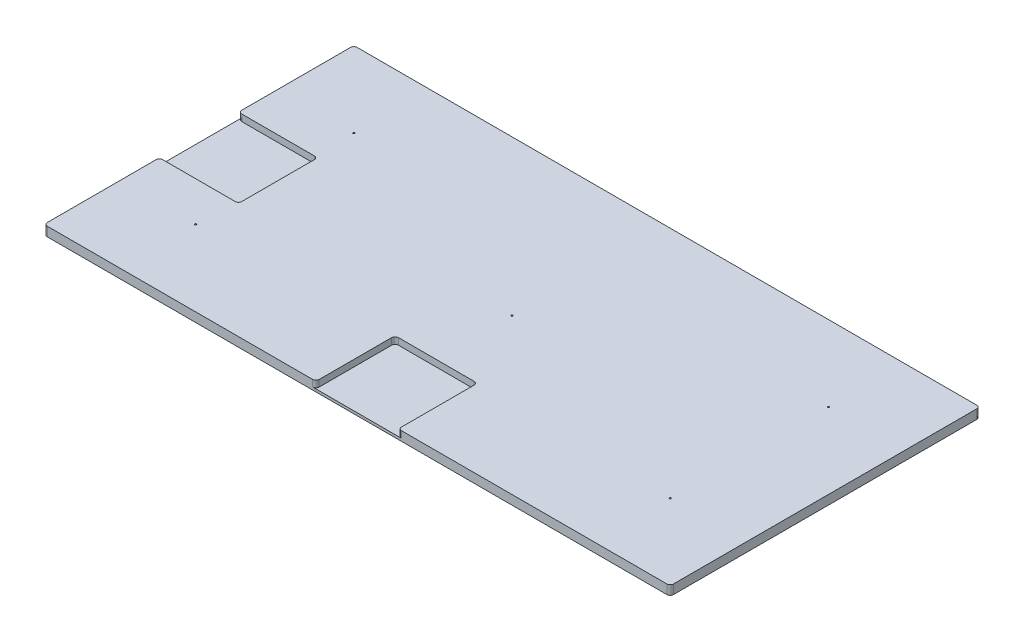
ISO-10303-21;
HEADER;
FILE_DESCRIPTION(('STEP AP214'),'2;1');
FILE_NAME('part.step','',(''),(''),'','','');
FILE_SCHEMA(('AUTOMOTIVE_DESIGN { 1 0 10303 214 1 1 1 1 }'));
ENDSEC;
DATA;
#1=APPLICATION_CONTEXT('core data for automotive mechanical design processes');
#2=APPLICATION_PROTOCOL_DEFINITION('international standard','automotive_design',2000,#1);
#3=PRODUCT_CONTEXT('',#1,'mechanical');
#4=PRODUCT('Part','Part','',(#3));
#5=PRODUCT_RELATED_PRODUCT_CATEGORY('part','',(#4));
#6=PRODUCT_DEFINITION_FORMATION('','',#4);
#7=PRODUCT_DEFINITION_CONTEXT('part definition',#1,'design');
#8=PRODUCT_DEFINITION('design','',#6,#7);
#9=PRODUCT_DEFINITION_SHAPE('','',#8);
#10=(LENGTH_UNIT() NAMED_UNIT(*) SI_UNIT(.MILLI.,.METRE.));
#11=(NAMED_UNIT(*) PLANE_ANGLE_UNIT() SI_UNIT($,.RADIAN.));
#12=(NAMED_UNIT(*) SI_UNIT($,.STERADIAN.) SOLID_ANGLE_UNIT());
#13=UNCERTAINTY_MEASURE_WITH_UNIT(LENGTH_MEASURE(1.E-05),#10,'distance_accuracy_value','');
#14=(GEOMETRIC_REPRESENTATION_CONTEXT(3) GLOBAL_UNCERTAINTY_ASSIGNED_CONTEXT((#13)) GLOBAL_UNIT_ASSIGNED_CONTEXT((#10,
#11,#12)) REPRESENTATION_CONTEXT('',''));
#15=CARTESIAN_POINT('',(0.,0.,0.));
#16=DIRECTION('',(0.,0.,1.));
#17=DIRECTION('',(1.,0.,0.));
#18=AXIS2_PLACEMENT_3D('',#15,#16,#17);
#19=CARTESIAN_POINT('',(603.25,17.78,298.45));
#20=DIRECTION('',(-1.,0.,0.));
#21=DIRECTION('',(0.,0.,1.));
#22=AXIS2_PLACEMENT_3D('',#19,#20,#21);
#23=PLANE('',#22);
#24=DIRECTION('',(0.,0.,-1.));
#25=VECTOR('',#24,1.);
#26=CARTESIAN_POINT('',(603.25,0.,298.45));
#27=LINE('',#26,#25);
#28=CARTESIAN_POINT('',(603.25,0.,292.1));
#29=VERTEX_POINT('',#28);
#30=CARTESIAN_POINT('',(603.25,0.,-292.1));
#31=VERTEX_POINT('',#30);
#32=EDGE_CURVE('E224',#29,#31,#27,.T.);
#33=ORIENTED_EDGE('',*,*,#32,.T.);
#34=DIRECTION('',(0.,-1.,0.));
#35=VECTOR('',#34,1.);
#36=CARTESIAN_POINT('',(603.25,17.78,-292.1));
#37=LINE('',#36,#35);
#38=CARTESIAN_POINT('',(603.25,17.78,-292.1));
#39=VERTEX_POINT('',#38);
#40=EDGE_CURVE('E202',#31,#39,#37,.F.);
#41=ORIENTED_EDGE('',*,*,#40,.T.);
#42=DIRECTION('',(0.,0.,-1.));
#43=VECTOR('',#42,1.);
#44=CARTESIAN_POINT('',(603.25,17.78,298.45));
#45=LINE('',#44,#43);
#46=CARTESIAN_POINT('',(603.25,17.78,292.1));
#47=VERTEX_POINT('',#46);
#48=EDGE_CURVE('E235',#47,#39,#45,.T.);
#49=ORIENTED_EDGE('',*,*,#48,.F.);
#50=DIRECTION('',(0.,-1.,0.));
#51=VECTOR('',#50,1.);
#52=CARTESIAN_POINT('',(603.25,17.78,292.1));
#53=LINE('',#52,#51);
#54=EDGE_CURVE('E207',#47,#29,#53,.T.);
#55=ORIENTED_EDGE('',*,*,#54,.T.);
#56=EDGE_LOOP('',(#33,#41,#49,#55));
#57=FACE_BOUND('',#56,.T.);
#58=ADVANCED_FACE('F35',(#57),#23,.F.);
#59=CARTESIAN_POINT('',(-603.25,17.78,-298.45));
#60=DIRECTION('',(0.,0.,1.));
#61=DIRECTION('',(1.,0.,0.));
#62=AXIS2_PLACEMENT_3D('',#59,#60,#61);
#63=PLANE('',#62);
#64=DIRECTION('',(-1.,0.,0.));
#65=VECTOR('',#64,1.);
#66=CARTESIAN_POINT('',(-603.25,17.78,-298.45));
#67=LINE('',#66,#65);
#68=CARTESIAN_POINT('',(596.9,17.78,-298.45));
#69=VERTEX_POINT('',#68);
#70=CARTESIAN_POINT('',(-596.9,17.78,-298.45));
#71=VERTEX_POINT('',#70);
#72=EDGE_CURVE('E217',#69,#71,#67,.T.);
#73=ORIENTED_EDGE('',*,*,#72,.F.);
#74=DIRECTION('',(0.,-1.,0.));
#75=VECTOR('',#74,1.);
#76=CARTESIAN_POINT('',(596.9,17.78,-298.45));
#77=LINE('',#76,#75);
#78=CARTESIAN_POINT('',(596.9,0.,-298.45));
#79=VERTEX_POINT('',#78);
#80=EDGE_CURVE('E201',#69,#79,#77,.T.);
#81=ORIENTED_EDGE('',*,*,#80,.T.);
#82=DIRECTION('',(-1.,0.,0.));
#83=VECTOR('',#82,1.);
#84=CARTESIAN_POINT('',(-603.25,0.,-298.45));
#85=LINE('',#84,#83);
#86=CARTESIAN_POINT('',(-596.9,0.,-298.45));
#87=VERTEX_POINT('',#86);
#88=EDGE_CURVE('E214',#79,#87,#85,.T.);
#89=ORIENTED_EDGE('',*,*,#88,.T.);
#90=DIRECTION('',(0.,-1.,0.));
#91=VECTOR('',#90,1.);
#92=CARTESIAN_POINT('',(-596.9,17.78,-298.45));
#93=LINE('',#92,#91);
#94=EDGE_CURVE('E219',#87,#71,#93,.F.);
#95=ORIENTED_EDGE('',*,*,#94,.T.);
#96=EDGE_LOOP('',(#73,#81,#89,#95));
#97=FACE_BOUND('',#96,.T.);
#98=ADVANCED_FACE('F213',(#97),#63,.F.);
#99=CARTESIAN_POINT('',(-603.25,17.78,298.45));
#100=DIRECTION('',(1.,0.,0.));
#101=DIRECTION('',(0.,0.,-1.));
#102=AXIS2_PLACEMENT_3D('',#99,#100,#101);
#103=PLANE('',#102);
#104=DIRECTION('',(0.,0.,1.));
#105=VECTOR('',#104,1.);
#106=CARTESIAN_POINT('',(-603.25,17.78,298.45));
#107=LINE('',#106,#105);
#108=CARTESIAN_POINT('',(-603.25,17.78,82.55));
#109=VERTEX_POINT('',#108);
#110=CARTESIAN_POINT('',(-603.25,17.78,292.1));
#111=VERTEX_POINT('',#110);
#112=EDGE_CURVE('E419',#109,#111,#107,.T.);
#113=ORIENTED_EDGE('',*,*,#112,.F.);
#114=DIRECTION('',(0.,1.,0.));
#115=VECTOR('',#114,1.);
#116=CARTESIAN_POINT('',(-603.25,17.78,82.55));
#117=LINE('',#116,#115);
#118=CARTESIAN_POINT('',(-603.25,5.08,82.55));
#119=VERTEX_POINT('',#118);
#120=EDGE_CURVE('E306',#109,#119,#117,.F.);
#121=ORIENTED_EDGE('',*,*,#120,.T.);
#122=DIRECTION('',(0.,0.,1.));
#123=VECTOR('',#122,1.);
#124=CARTESIAN_POINT('',(-603.25,5.08,-76.2));
#125=LINE('',#124,#123);
#126=CARTESIAN_POINT('',(-603.25,5.08,-82.55));
#127=VERTEX_POINT('',#126);
#128=EDGE_CURVE('E360',#127,#119,#125,.T.);
#129=ORIENTED_EDGE('',*,*,#128,.F.);
#130=DIRECTION('',(0.,1.,0.));
#131=VECTOR('',#130,1.);
#132=CARTESIAN_POINT('',(-603.25,17.78,-82.55));
#133=LINE('',#132,#131);
#134=CARTESIAN_POINT('',(-603.25,17.78,-82.55));
#135=VERTEX_POINT('',#134);
#136=EDGE_CURVE('E303',#127,#135,#133,.T.);
#137=ORIENTED_EDGE('',*,*,#136,.T.);
#138=CARTESIAN_POINT('',(-603.25,17.78,-292.1));
#139=VERTEX_POINT('',#138);
#140=EDGE_CURVE('E420',#139,#135,#107,.T.);
#141=ORIENTED_EDGE('',*,*,#140,.F.);
#142=DIRECTION('',(0.,-1.,0.));
#143=VECTOR('',#142,1.);
#144=CARTESIAN_POINT('',(-603.25,17.78,-292.1));
#145=LINE('',#144,#143);
#146=CARTESIAN_POINT('',(-603.25,0.,-292.1));
#147=VERTEX_POINT('',#146);
#148=EDGE_CURVE('E259',#139,#147,#145,.T.);
#149=ORIENTED_EDGE('',*,*,#148,.T.);
#150=DIRECTION('',(0.,0.,1.));
#151=VECTOR('',#150,1.);
#152=CARTESIAN_POINT('',(-603.25,0.,298.45));
#153=LINE('',#152,#151);
#154=CARTESIAN_POINT('',(-603.25,0.,292.1));
#155=VERTEX_POINT('',#154);
#156=EDGE_CURVE('E223',#147,#155,#153,.T.);
#157=ORIENTED_EDGE('',*,*,#156,.T.);
#158=DIRECTION('',(0.,-1.,0.));
#159=VECTOR('',#158,1.);
#160=CARTESIAN_POINT('',(-603.25,17.78,292.1));
#161=LINE('',#160,#159);
#162=EDGE_CURVE('E262',#155,#111,#161,.F.);
#163=ORIENTED_EDGE('',*,*,#162,.T.);
#164=EDGE_LOOP('',(#113,#121,#129,#137,#141,#149,#157,#163));
#165=FACE_BOUND('',#164,.T.);
#166=ADVANCED_FACE('F442',(#165),#103,.F.);
#167=CARTESIAN_POINT('',(-603.25,17.78,298.45));
#168=DIRECTION('',(0.,0.,-1.));
#169=DIRECTION('',(-1.,0.,0.));
#170=AXIS2_PLACEMENT_3D('',#167,#168,#169);
#171=PLANE('',#170);
#172=DIRECTION('',(1.,0.,0.));
#173=VECTOR('',#172,1.);
#174=CARTESIAN_POINT('',(-603.25,17.78,298.45));
#175=LINE('',#174,#173);
#176=CARTESIAN_POINT('',(85.7250000000001,17.78,298.45));
#177=VERTEX_POINT('',#176);
#178=CARTESIAN_POINT('',(596.9,17.78,298.45));
#179=VERTEX_POINT('',#178);
#180=EDGE_CURVE('E422',#177,#179,#175,.T.);
#181=ORIENTED_EDGE('',*,*,#180,.F.);
#182=DIRECTION('',(0.,1.,0.));
#183=VECTOR('',#182,1.);
#184=CARTESIAN_POINT('',(85.7250000000001,17.78,298.45));
#185=LINE('',#184,#183);
#186=CARTESIAN_POINT('',(85.725,5.08,298.45));
#187=VERTEX_POINT('',#186);
#188=EDGE_CURVE('E281',#177,#187,#185,.F.);
#189=ORIENTED_EDGE('',*,*,#188,.T.);
#190=DIRECTION('',(1.,0.,0.));
#191=VECTOR('',#190,1.);
#192=CARTESIAN_POINT('',(-79.3749999999999,5.08,298.45));
#193=LINE('',#192,#191);
#194=CARTESIAN_POINT('',(-85.7249999999999,5.08,298.45));
#195=VERTEX_POINT('',#194);
#196=EDGE_CURVE('E378',#195,#187,#193,.T.);
#197=ORIENTED_EDGE('',*,*,#196,.F.);
#198=DIRECTION('',(0.,1.,0.));
#199=VECTOR('',#198,1.);
#200=CARTESIAN_POINT('',(-85.7249999999999,17.78,298.45));
#201=LINE('',#200,#199);
#202=CARTESIAN_POINT('',(-85.7249999999999,17.78,298.45));
#203=VERTEX_POINT('',#202);
#204=EDGE_CURVE('E278',#195,#203,#201,.T.);
#205=ORIENTED_EDGE('',*,*,#204,.T.);
#206=CARTESIAN_POINT('',(-596.9,17.78,298.45));
#207=VERTEX_POINT('',#206);
#208=EDGE_CURVE('E236',#207,#203,#175,.T.);
#209=ORIENTED_EDGE('',*,*,#208,.F.);
#210=DIRECTION('',(0.,-1.,0.));
#211=VECTOR('',#210,1.);
#212=CARTESIAN_POINT('',(-596.9,17.78,298.45));
#213=LINE('',#212,#211);
#214=CARTESIAN_POINT('',(-596.9,0.,298.45));
#215=VERTEX_POINT('',#214);
#216=EDGE_CURVE('E253',#207,#215,#213,.T.);
#217=ORIENTED_EDGE('',*,*,#216,.T.);
#218=DIRECTION('',(1.,0.,0.));
#219=VECTOR('',#218,1.);
#220=CARTESIAN_POINT('',(-603.25,0.,298.45));
#221=LINE('',#220,#219);
#222=CARTESIAN_POINT('',(596.9,0.,298.45));
#223=VERTEX_POINT('',#222);
#224=EDGE_CURVE('E227',#215,#223,#221,.T.);
#225=ORIENTED_EDGE('',*,*,#224,.T.);
#226=DIRECTION('',(0.,-1.,0.));
#227=VECTOR('',#226,1.);
#228=CARTESIAN_POINT('',(596.9,17.78,298.45));
#229=LINE('',#228,#227);
#230=EDGE_CURVE('E256',#223,#179,#229,.F.);
#231=ORIENTED_EDGE('',*,*,#230,.T.);
#232=EDGE_LOOP('',(#181,#189,#197,#205,#209,#217,#225,#231));
#233=FACE_BOUND('',#232,.T.);
#234=ADVANCED_FACE('F431',(#233),#171,.F.);
#235=CARTESIAN_POINT('',(0.,17.78,0.));
#236=DIRECTION('',(0.,-1.,0.));
#237=DIRECTION('',(0.,0.,-1.));
#238=AXIS2_PLACEMENT_3D('',#235,#236,#237);
#239=PLANE('',#238);
#240=CARTESIAN_POINT('',(457.2,17.78,-152.4));
#241=DIRECTION('',(0.,1.,0.));
#242=DIRECTION('',(0.,0.,1.));
#243=AXIS2_PLACEMENT_3D('',#240,#241,#242);
#244=CIRCLE('',#243,1.58749999999996);
#245=CARTESIAN_POINT('',(457.2,17.78,-150.8125));
#246=VERTEX_POINT('',#245);
#247=EDGE_CURVE('E380',#246,#246,#244,.T.);
#248=ORIENTED_EDGE('',*,*,#247,.F.);
#249=EDGE_LOOP('',(#248));
#250=FACE_BOUND('',#249,.T.);
#251=CARTESIAN_POINT('',(-457.2,17.78,152.4));
#252=DIRECTION('',(0.,1.,0.));
#253=DIRECTION('',(0.,0.,1.));
#254=AXIS2_PLACEMENT_3D('',#251,#252,#253);
#255=CIRCLE('',#254,1.58749999999996);
#256=CARTESIAN_POINT('',(-457.2,17.78,153.9875));
#257=VERTEX_POINT('',#256);
#258=EDGE_CURVE('E393',#257,#257,#255,.T.);
#259=ORIENTED_EDGE('',*,*,#258,.F.);
#260=EDGE_LOOP('',(#259));
#261=FACE_BOUND('',#260,.T.);
#262=CARTESIAN_POINT('',(-457.2,17.78,-152.4));
#263=DIRECTION('',(0.,1.,0.));
#264=DIRECTION('',(0.,0.,1.));
#265=AXIS2_PLACEMENT_3D('',#262,#263,#264);
#266=CIRCLE('',#265,1.58749999999996);
#267=CARTESIAN_POINT('',(-457.2,17.78,-150.8125));
#268=VERTEX_POINT('',#267);
#269=EDGE_CURVE('E399',#268,#268,#266,.T.);
#270=ORIENTED_EDGE('',*,*,#269,.F.);
#271=EDGE_LOOP('',(#270));
#272=FACE_BOUND('',#271,.T.);
#273=CARTESIAN_POINT('',(457.2,17.78,152.4));
#274=DIRECTION('',(0.,1.,0.));
#275=DIRECTION('',(0.,0.,1.));
#276=AXIS2_PLACEMENT_3D('',#273,#274,#275);
#277=CIRCLE('',#276,1.58749999999996);
#278=CARTESIAN_POINT('',(457.2,17.78,153.9875));
#279=VERTEX_POINT('',#278);
#280=EDGE_CURVE('E405',#279,#279,#277,.T.);
#281=ORIENTED_EDGE('',*,*,#280,.F.);
#282=EDGE_LOOP('',(#281));
#283=FACE_BOUND('',#282,.T.);
#284=CARTESIAN_POINT('',(0.,17.78,0.));
#285=DIRECTION('',(0.,1.,0.));
#286=DIRECTION('',(0.,0.,1.));
#287=AXIS2_PLACEMENT_3D('',#284,#285,#286);
#288=CIRCLE('',#287,1.58749999999999);
#289=CARTESIAN_POINT('',(0.,17.78,1.58749999999999));
#290=VERTEX_POINT('',#289);
#291=EDGE_CURVE('E411',#290,#290,#288,.T.);
#292=ORIENTED_EDGE('',*,*,#291,.F.);
#293=EDGE_LOOP('',(#292));
#294=FACE_BOUND('',#293,.T.);
#295=DIRECTION('',(0.,0.,-1.));
#296=VECTOR('',#295,1.);
#297=CARTESIAN_POINT('',(79.3750000000001,17.78,146.05));
#298=LINE('',#297,#296);
#299=CARTESIAN_POINT('',(79.3750000000001,17.78,292.1));
#300=VERTEX_POINT('',#299);
#301=CARTESIAN_POINT('',(79.3750000000001,17.78,152.4));
#302=VERTEX_POINT('',#301);
#303=EDGE_CURVE('E358',#300,#302,#298,.T.);
#304=ORIENTED_EDGE('',*,*,#303,.F.);
#305=CARTESIAN_POINT('',(85.7250000000001,17.78,292.1));
#306=DIRECTION('',(0.,-1.,0.));
#307=DIRECTION('',(0.,0.,-1.));
#308=AXIS2_PLACEMENT_3D('',#305,#306,#307);
#309=CIRCLE('',#308,6.35);
#310=EDGE_CURVE('E276',#300,#177,#309,.F.);
#311=ORIENTED_EDGE('',*,*,#310,.T.);
#312=ORIENTED_EDGE('',*,*,#180,.T.);
#313=CARTESIAN_POINT('',(596.9,17.78,292.1));
#314=DIRECTION('',(0.,-1.,0.));
#315=DIRECTION('',(0.,0.,-1.));
#316=AXIS2_PLACEMENT_3D('',#313,#314,#315);
#317=CIRCLE('',#316,6.35);
#318=EDGE_CURVE('E249',#179,#47,#317,.F.);
#319=ORIENTED_EDGE('',*,*,#318,.T.);
#320=ORIENTED_EDGE('',*,*,#48,.T.);
#321=CARTESIAN_POINT('',(596.9,17.78,-292.1));
#322=DIRECTION('',(0.,-1.,0.));
#323=DIRECTION('',(0.,0.,-1.));
#324=AXIS2_PLACEMENT_3D('',#321,#322,#323);
#325=CIRCLE('',#324,6.35);
#326=EDGE_CURVE('E251',#39,#69,#325,.F.);
#327=ORIENTED_EDGE('',*,*,#326,.T.);
#328=ORIENTED_EDGE('',*,*,#72,.T.);
#329=CARTESIAN_POINT('',(-596.9,17.78,-292.1));
#330=DIRECTION('',(0.,-1.,0.));
#331=DIRECTION('',(0.,0.,-1.));
#332=AXIS2_PLACEMENT_3D('',#329,#330,#331);
#333=CIRCLE('',#332,6.35);
#334=EDGE_CURVE('E245',#71,#139,#333,.F.);
#335=ORIENTED_EDGE('',*,*,#334,.T.);
#336=ORIENTED_EDGE('',*,*,#140,.T.);
#337=CARTESIAN_POINT('',(-596.9,17.78,-82.55));
#338=DIRECTION('',(0.,-1.,0.));
#339=DIRECTION('',(0.,0.,-1.));
#340=AXIS2_PLACEMENT_3D('',#337,#338,#339);
#341=CIRCLE('',#340,6.35);
#342=CARTESIAN_POINT('',(-596.9,17.78,-76.2));
#343=VERTEX_POINT('',#342);
#344=EDGE_CURVE('E270',#135,#343,#341,.F.);
#345=ORIENTED_EDGE('',*,*,#344,.T.);
#346=DIRECTION('',(-1.,0.,0.));
#347=VECTOR('',#346,1.);
#348=CARTESIAN_POINT('',(-450.85,17.78,-76.2));
#349=LINE('',#348,#347);
#350=CARTESIAN_POINT('',(-457.2,17.78,-76.2));
#351=VERTEX_POINT('',#350);
#352=EDGE_CURVE('E365',#351,#343,#349,.T.);
#353=ORIENTED_EDGE('',*,*,#352,.F.);
#354=CARTESIAN_POINT('',(-457.2,17.78,-69.85));
#355=DIRECTION('',(0.,-1.,0.));
#356=DIRECTION('',(0.,0.,-1.));
#357=AXIS2_PLACEMENT_3D('',#354,#355,#356);
#358=CIRCLE('',#357,6.35);
#359=CARTESIAN_POINT('',(-450.85,17.78,-69.85));
#360=VERTEX_POINT('',#359);
#361=EDGE_CURVE('E11',#351,#360,#358,.T.);
#362=ORIENTED_EDGE('',*,*,#361,.T.);
#363=DIRECTION('',(0.,0.,-1.));
#364=VECTOR('',#363,1.);
#365=CARTESIAN_POINT('',(-450.85,17.78,-76.2));
#366=LINE('',#365,#364);
#367=CARTESIAN_POINT('',(-450.85,17.78,69.85));
#368=VERTEX_POINT('',#367);
#369=EDGE_CURVE('E341',#368,#360,#366,.T.);
#370=ORIENTED_EDGE('',*,*,#369,.F.);
#371=CARTESIAN_POINT('',(-457.2,17.78,69.85));
#372=DIRECTION('',(0.,-1.,0.));
#373=DIRECTION('',(0.,0.,-1.));
#374=AXIS2_PLACEMENT_3D('',#371,#372,#373);
#375=CIRCLE('',#374,6.35);
#376=CARTESIAN_POINT('',(-457.2,17.78,76.2));
#377=VERTEX_POINT('',#376);
#378=EDGE_CURVE('E43',#368,#377,#375,.T.);
#379=ORIENTED_EDGE('',*,*,#378,.T.);
#380=DIRECTION('',(1.,0.,0.));
#381=VECTOR('',#380,1.);
#382=CARTESIAN_POINT('',(-450.85,17.78,76.2));
#383=LINE('',#382,#381);
#384=CARTESIAN_POINT('',(-596.9,17.78,76.2));
#385=VERTEX_POINT('',#384);
#386=EDGE_CURVE('E340',#385,#377,#383,.T.);
#387=ORIENTED_EDGE('',*,*,#386,.F.);
#388=CARTESIAN_POINT('',(-596.9,17.78,82.55));
#389=DIRECTION('',(0.,-1.,0.));
#390=DIRECTION('',(0.,0.,-1.));
#391=AXIS2_PLACEMENT_3D('',#388,#389,#390);
#392=CIRCLE('',#391,6.35);
#393=EDGE_CURVE('E272',#385,#109,#392,.F.);
#394=ORIENTED_EDGE('',*,*,#393,.T.);
#395=ORIENTED_EDGE('',*,*,#112,.T.);
#396=CARTESIAN_POINT('',(-596.9,17.78,292.1));
#397=DIRECTION('',(0.,-1.,0.));
#398=DIRECTION('',(0.,0.,-1.));
#399=AXIS2_PLACEMENT_3D('',#396,#397,#398);
#400=CIRCLE('',#399,6.35);
#401=EDGE_CURVE('E247',#111,#207,#400,.F.);
#402=ORIENTED_EDGE('',*,*,#401,.T.);
#403=ORIENTED_EDGE('',*,*,#208,.T.);
#404=CARTESIAN_POINT('',(-85.7249999999999,17.78,292.1));
#405=DIRECTION('',(0.,-1.,0.));
#406=DIRECTION('',(0.,0.,-1.));
#407=AXIS2_PLACEMENT_3D('',#404,#405,#406);
#408=CIRCLE('',#407,6.35);
#409=CARTESIAN_POINT('',(-79.3749999999999,17.78,292.1));
#410=VERTEX_POINT('',#409);
#411=EDGE_CURVE('E274',#203,#410,#408,.F.);
#412=ORIENTED_EDGE('',*,*,#411,.T.);
#413=DIRECTION('',(0.,0.,1.));
#414=VECTOR('',#413,1.);
#415=CARTESIAN_POINT('',(-79.3749999999999,17.78,146.05));
#416=LINE('',#415,#414);
#417=CARTESIAN_POINT('',(-79.3749999999999,17.78,152.4));
#418=VERTEX_POINT('',#417);
#419=EDGE_CURVE('E372',#418,#410,#416,.T.);
#420=ORIENTED_EDGE('',*,*,#419,.F.);
#421=CARTESIAN_POINT('',(-73.0249999999999,17.78,152.4));
#422=DIRECTION('',(0.,-1.,0.));
#423=DIRECTION('',(0.,0.,-1.));
#424=AXIS2_PLACEMENT_3D('',#421,#422,#423);
#425=CIRCLE('',#424,6.35);
#426=CARTESIAN_POINT('',(-73.0249999999999,17.78,146.05));
#427=VERTEX_POINT('',#426);
#428=EDGE_CURVE('E326',#418,#427,#425,.T.);
#429=ORIENTED_EDGE('',*,*,#428,.T.);
#430=DIRECTION('',(-1.,0.,0.));
#431=VECTOR('',#430,1.);
#432=CARTESIAN_POINT('',(-79.3749999999999,17.78,146.05));
#433=LINE('',#432,#431);
#434=CARTESIAN_POINT('',(73.025,17.78,146.05));
#435=VERTEX_POINT('',#434);
#436=EDGE_CURVE('E383',#435,#427,#433,.T.);
#437=ORIENTED_EDGE('',*,*,#436,.F.);
#438=CARTESIAN_POINT('',(73.0250000000001,17.78,152.4));
#439=DIRECTION('',(0.,-1.,0.));
#440=DIRECTION('',(0.,0.,-1.));
#441=AXIS2_PLACEMENT_3D('',#438,#439,#440);
#442=CIRCLE('',#441,6.35);
#443=EDGE_CURVE('E328',#435,#302,#442,.T.);
#444=ORIENTED_EDGE('',*,*,#443,.T.);
#445=EDGE_LOOP('',(#304,#311,#312,#319,#320,#327,#328,#335,#336,#345,#353,#362,#370,#379,#387,
#394,#395,#402,#403,#412,#420,#429,#437,#444));
#446=FACE_BOUND('',#445,.T.);
#447=ADVANCED_FACE('F339',(#250,#261,#272,#283,#294,#446),#239,.F.);
#448=CARTESIAN_POINT('',(0.,0.,0.));
#449=DIRECTION('',(0.,-1.,0.));
#450=DIRECTION('',(0.,0.,-1.));
#451=AXIS2_PLACEMENT_3D('',#448,#449,#450);
#452=PLANE('',#451);
#453=CARTESIAN_POINT('',(457.2,0.,-152.4));
#454=DIRECTION('',(0.,1.,0.));
#455=DIRECTION('',(0.,0.,1.));
#456=AXIS2_PLACEMENT_3D('',#453,#454,#455);
#457=CIRCLE('',#456,1.58750000000002);
#458=CARTESIAN_POINT('',(457.2,0.,-150.8125));
#459=VERTEX_POINT('',#458);
#460=EDGE_CURVE('E390',#459,#459,#457,.T.);
#461=ORIENTED_EDGE('',*,*,#460,.T.);
#462=EDGE_LOOP('',(#461));
#463=FACE_BOUND('',#462,.T.);
#464=CARTESIAN_POINT('',(-457.2,0.,152.4));
#465=DIRECTION('',(0.,1.,0.));
#466=DIRECTION('',(0.,0.,1.));
#467=AXIS2_PLACEMENT_3D('',#464,#465,#466);
#468=CIRCLE('',#467,1.58750000000002);
#469=CARTESIAN_POINT('',(-457.2,0.,153.9875));
#470=VERTEX_POINT('',#469);
#471=EDGE_CURVE('E396',#470,#470,#468,.T.);
#472=ORIENTED_EDGE('',*,*,#471,.T.);
#473=EDGE_LOOP('',(#472));
#474=FACE_BOUND('',#473,.T.);
#475=CARTESIAN_POINT('',(-457.2,0.,-152.4));
#476=DIRECTION('',(0.,1.,0.));
#477=DIRECTION('',(0.,0.,1.));
#478=AXIS2_PLACEMENT_3D('',#475,#476,#477);
#479=CIRCLE('',#478,1.58750000000002);
#480=CARTESIAN_POINT('',(-457.2,0.,-150.8125));
#481=VERTEX_POINT('',#480);
#482=EDGE_CURVE('E402',#481,#481,#479,.T.);
#483=ORIENTED_EDGE('',*,*,#482,.T.);
#484=EDGE_LOOP('',(#483));
#485=FACE_BOUND('',#484,.T.);
#486=CARTESIAN_POINT('',(457.2,0.,152.4));
#487=DIRECTION('',(0.,1.,0.));
#488=DIRECTION('',(0.,0.,1.));
#489=AXIS2_PLACEMENT_3D('',#486,#487,#488);
#490=CIRCLE('',#489,1.58750000000002);
#491=CARTESIAN_POINT('',(457.2,0.,153.9875));
#492=VERTEX_POINT('',#491);
#493=EDGE_CURVE('E408',#492,#492,#490,.T.);
#494=ORIENTED_EDGE('',*,*,#493,.T.);
#495=EDGE_LOOP('',(#494));
#496=FACE_BOUND('',#495,.T.);
#497=CARTESIAN_POINT('',(0.,0.,0.));
#498=DIRECTION('',(0.,1.,0.));
#499=DIRECTION('',(0.,0.,1.));
#500=AXIS2_PLACEMENT_3D('',#497,#498,#499);
#501=CIRCLE('',#500,1.5875);
#502=CARTESIAN_POINT('',(0.,0.,1.5875));
#503=VERTEX_POINT('',#502);
#504=EDGE_CURVE('E229',#503,#503,#501,.T.);
#505=ORIENTED_EDGE('',*,*,#504,.T.);
#506=EDGE_LOOP('',(#505));
#507=FACE_BOUND('',#506,.T.);
#508=ORIENTED_EDGE('',*,*,#88,.F.);
#509=CARTESIAN_POINT('',(596.9,0.,-292.1));
#510=DIRECTION('',(0.,-1.,0.));
#511=DIRECTION('',(0.,0.,-1.));
#512=AXIS2_PLACEMENT_3D('',#509,#510,#511);
#513=CIRCLE('',#512,6.35);
#514=EDGE_CURVE('E197',#79,#31,#513,.T.);
#515=ORIENTED_EDGE('',*,*,#514,.T.);
#516=ORIENTED_EDGE('',*,*,#32,.F.);
#517=CARTESIAN_POINT('',(596.9,0.,292.1));
#518=DIRECTION('',(0.,-1.,0.));
#519=DIRECTION('',(0.,0.,-1.));
#520=AXIS2_PLACEMENT_3D('',#517,#518,#519);
#521=CIRCLE('',#520,6.35);
#522=EDGE_CURVE('E208',#29,#223,#521,.T.);
#523=ORIENTED_EDGE('',*,*,#522,.T.);
#524=ORIENTED_EDGE('',*,*,#224,.F.);
#525=CARTESIAN_POINT('',(-596.9,0.,292.1));
#526=DIRECTION('',(0.,-1.,0.));
#527=DIRECTION('',(0.,0.,-1.));
#528=AXIS2_PLACEMENT_3D('',#525,#526,#527);
#529=CIRCLE('',#528,6.35);
#530=EDGE_CURVE('E239',#215,#155,#529,.T.);
#531=ORIENTED_EDGE('',*,*,#530,.T.);
#532=ORIENTED_EDGE('',*,*,#156,.F.);
#533=CARTESIAN_POINT('',(-596.9,0.,-292.1));
#534=DIRECTION('',(0.,-1.,0.));
#535=DIRECTION('',(0.,0.,-1.));
#536=AXIS2_PLACEMENT_3D('',#533,#534,#535);
#537=CIRCLE('',#536,6.35);
#538=EDGE_CURVE('E218',#147,#87,#537,.T.);
#539=ORIENTED_EDGE('',*,*,#538,.T.);
#540=EDGE_LOOP('',(#508,#515,#516,#523,#524,#531,#532,#539));
#541=FACE_BOUND('',#540,.T.);
#542=ADVANCED_FACE('F221',(#463,#474,#485,#496,#507,#541),#452,.T.);
#543=CARTESIAN_POINT('',(0.,17.78,0.));
#544=DIRECTION('',(0.,1.,0.));
#545=DIRECTION('',(0.,0.,1.));
#546=AXIS2_PLACEMENT_3D('',#543,#544,#545);
#547=CYLINDRICAL_SURFACE('',#546,1.58749999999999);
#548=ORIENTED_EDGE('',*,*,#504,.F.);
#549=EDGE_LOOP('',(#548));
#550=FACE_BOUND('',#549,.T.);
#551=ORIENTED_EDGE('',*,*,#291,.T.);
#552=EDGE_LOOP('',(#551));
#553=FACE_BOUND('',#552,.T.);
#554=ADVANCED_FACE('F701',(#550,#553),#547,.F.);
#555=CARTESIAN_POINT('',(457.2,17.78,152.4));
#556=DIRECTION('',(0.,1.,0.));
#557=DIRECTION('',(0.,0.,1.));
#558=AXIS2_PLACEMENT_3D('',#555,#556,#557);
#559=CYLINDRICAL_SURFACE('',#558,1.58749999999999);
#560=ORIENTED_EDGE('',*,*,#493,.F.);
#561=EDGE_LOOP('',(#560));
#562=FACE_BOUND('',#561,.T.);
#563=ORIENTED_EDGE('',*,*,#280,.T.);
#564=EDGE_LOOP('',(#563));
#565=FACE_BOUND('',#564,.T.);
#566=ADVANCED_FACE('F691',(#562,#565),#559,.F.);
#567=CARTESIAN_POINT('',(-457.2,17.78,-152.4));
#568=DIRECTION('',(0.,1.,0.));
#569=DIRECTION('',(0.,0.,1.));
#570=AXIS2_PLACEMENT_3D('',#567,#568,#569);
#571=CYLINDRICAL_SURFACE('',#570,1.58749999999999);
#572=ORIENTED_EDGE('',*,*,#482,.F.);
#573=EDGE_LOOP('',(#572));
#574=FACE_BOUND('',#573,.T.);
#575=ORIENTED_EDGE('',*,*,#269,.T.);
#576=EDGE_LOOP('',(#575));
#577=FACE_BOUND('',#576,.T.);
#578=ADVANCED_FACE('F681',(#574,#577),#571,.F.);
#579=CARTESIAN_POINT('',(-457.2,17.78,152.4));
#580=DIRECTION('',(0.,1.,0.));
#581=DIRECTION('',(0.,0.,1.));
#582=AXIS2_PLACEMENT_3D('',#579,#580,#581);
#583=CYLINDRICAL_SURFACE('',#582,1.58749999999999);
#584=ORIENTED_EDGE('',*,*,#471,.F.);
#585=EDGE_LOOP('',(#584));
#586=FACE_BOUND('',#585,.T.);
#587=ORIENTED_EDGE('',*,*,#258,.T.);
#588=EDGE_LOOP('',(#587));
#589=FACE_BOUND('',#588,.T.);
#590=ADVANCED_FACE('F670',(#586,#589),#583,.F.);
#591=CARTESIAN_POINT('',(457.2,17.78,-152.4));
#592=DIRECTION('',(0.,1.,0.));
#593=DIRECTION('',(0.,0.,1.));
#594=AXIS2_PLACEMENT_3D('',#591,#592,#593);
#595=CYLINDRICAL_SURFACE('',#594,1.58749999999999);
#596=ORIENTED_EDGE('',*,*,#460,.F.);
#597=EDGE_LOOP('',(#596));
#598=FACE_BOUND('',#597,.T.);
#599=ORIENTED_EDGE('',*,*,#247,.T.);
#600=EDGE_LOOP('',(#599));
#601=FACE_BOUND('',#600,.T.);
#602=ADVANCED_FACE('F501',(#598,#601),#595,.F.);
#603=CARTESIAN_POINT('',(596.9,17.78,-292.1));
#604=DIRECTION('',(0.,-1.,0.));
#605=DIRECTION('',(0.,0.,-1.));
#606=AXIS2_PLACEMENT_3D('',#603,#604,#605);
#607=CYLINDRICAL_SURFACE('',#606,6.35);
#608=ORIENTED_EDGE('',*,*,#326,.F.);
#609=ORIENTED_EDGE('',*,*,#40,.F.);
#610=ORIENTED_EDGE('',*,*,#514,.F.);
#611=ORIENTED_EDGE('',*,*,#80,.F.);
#612=EDGE_LOOP('',(#608,#609,#610,#611));
#613=FACE_BOUND('',#612,.T.);
#614=ADVANCED_FACE('F200',(#613),#607,.T.);
#615=CARTESIAN_POINT('',(596.9,17.78,292.1));
#616=DIRECTION('',(0.,-1.,0.));
#617=DIRECTION('',(0.,0.,-1.));
#618=AXIS2_PLACEMENT_3D('',#615,#616,#617);
#619=CYLINDRICAL_SURFACE('',#618,6.35);
#620=ORIENTED_EDGE('',*,*,#318,.F.);
#621=ORIENTED_EDGE('',*,*,#230,.F.);
#622=ORIENTED_EDGE('',*,*,#522,.F.);
#623=ORIENTED_EDGE('',*,*,#54,.F.);
#624=EDGE_LOOP('',(#620,#621,#622,#623));
#625=FACE_BOUND('',#624,.T.);
#626=ADVANCED_FACE('F435',(#625),#619,.T.);
#627=CARTESIAN_POINT('',(-596.9,17.78,292.1));
#628=DIRECTION('',(0.,-1.,0.));
#629=DIRECTION('',(0.,0.,-1.));
#630=AXIS2_PLACEMENT_3D('',#627,#628,#629);
#631=CYLINDRICAL_SURFACE('',#630,6.35);
#632=ORIENTED_EDGE('',*,*,#401,.F.);
#633=ORIENTED_EDGE('',*,*,#162,.F.);
#634=ORIENTED_EDGE('',*,*,#530,.F.);
#635=ORIENTED_EDGE('',*,*,#216,.F.);
#636=EDGE_LOOP('',(#632,#633,#634,#635));
#637=FACE_BOUND('',#636,.T.);
#638=ADVANCED_FACE('F446',(#637),#631,.T.);
#639=CARTESIAN_POINT('',(-596.9,17.78,-292.1));
#640=DIRECTION('',(0.,-1.,0.));
#641=DIRECTION('',(0.,0.,-1.));
#642=AXIS2_PLACEMENT_3D('',#639,#640,#641);
#643=CYLINDRICAL_SURFACE('',#642,6.35);
#644=ORIENTED_EDGE('',*,*,#334,.F.);
#645=ORIENTED_EDGE('',*,*,#94,.F.);
#646=ORIENTED_EDGE('',*,*,#538,.F.);
#647=ORIENTED_EDGE('',*,*,#148,.F.);
#648=EDGE_LOOP('',(#644,#645,#646,#647));
#649=FACE_BOUND('',#648,.T.);
#650=ADVANCED_FACE('F506',(#649),#643,.T.);
#651=CARTESIAN_POINT('',(79.3750000000001,5.08,146.05));
#652=DIRECTION('',(1.,0.,0.));
#653=DIRECTION('',(0.,0.,-1.));
#654=AXIS2_PLACEMENT_3D('',#651,#652,#653);
#655=PLANE('',#654);
#656=DIRECTION('',(0.,0.,-1.));
#657=VECTOR('',#656,1.);
#658=CARTESIAN_POINT('',(79.3750000000001,5.08,146.05));
#659=LINE('',#658,#657);
#660=CARTESIAN_POINT('',(79.3750000000001,5.08,292.1));
#661=VERTEX_POINT('',#660);
#662=CARTESIAN_POINT('',(79.3750000000001,5.08,152.4));
#663=VERTEX_POINT('',#662);
#664=EDGE_CURVE('E368',#661,#663,#659,.T.);
#665=ORIENTED_EDGE('',*,*,#664,.F.);
#666=DIRECTION('',(0.,1.,0.));
#667=VECTOR('',#666,1.);
#668=CARTESIAN_POINT('',(79.3750000000001,5.08,292.1));
#669=LINE('',#668,#667);
#670=EDGE_CURVE('E267',#661,#300,#669,.T.);
#671=ORIENTED_EDGE('',*,*,#670,.T.);
#672=ORIENTED_EDGE('',*,*,#303,.T.);
#673=DIRECTION('',(0.,1.,0.));
#674=VECTOR('',#673,1.);
#675=CARTESIAN_POINT('',(79.3750000000001,5.08,152.4));
#676=LINE('',#675,#674);
#677=EDGE_CURVE('E265',#302,#663,#676,.F.);
#678=ORIENTED_EDGE('',*,*,#677,.T.);
#679=EDGE_LOOP('',(#665,#671,#672,#678));
#680=FACE_BOUND('',#679,.T.);
#681=ADVANCED_FACE('F472',(#680),#655,.F.);
#682=CARTESIAN_POINT('',(-79.3749999999999,5.08,146.05));
#683=DIRECTION('',(-1.,0.,0.));
#684=DIRECTION('',(0.,0.,1.));
#685=AXIS2_PLACEMENT_3D('',#682,#683,#684);
#686=PLANE('',#685);
#687=ORIENTED_EDGE('',*,*,#419,.T.);
#688=DIRECTION('',(0.,1.,0.));
#689=VECTOR('',#688,1.);
#690=CARTESIAN_POINT('',(-79.3749999999999,5.08,292.1));
#691=LINE('',#690,#689);
#692=CARTESIAN_POINT('',(-79.3749999999999,5.08,292.1));
#693=VERTEX_POINT('',#692);
#694=EDGE_CURVE('E287',#410,#693,#691,.F.);
#695=ORIENTED_EDGE('',*,*,#694,.T.);
#696=DIRECTION('',(0.,0.,1.));
#697=VECTOR('',#696,1.);
#698=CARTESIAN_POINT('',(-79.3749999999999,5.08,146.05));
#699=LINE('',#698,#697);
#700=CARTESIAN_POINT('',(-79.3749999999999,5.08,152.4));
#701=VERTEX_POINT('',#700);
#702=EDGE_CURVE('E375',#701,#693,#699,.T.);
#703=ORIENTED_EDGE('',*,*,#702,.F.);
#704=DIRECTION('',(0.,1.,0.));
#705=VECTOR('',#704,1.);
#706=CARTESIAN_POINT('',(-79.3749999999999,17.78,152.4));
#707=LINE('',#706,#705);
#708=EDGE_CURVE('E284',#701,#418,#707,.T.);
#709=ORIENTED_EDGE('',*,*,#708,.T.);
#710=EDGE_LOOP('',(#687,#695,#703,#709));
#711=FACE_BOUND('',#710,.T.);
#712=ADVANCED_FACE('F454',(#711),#686,.F.);
#713=CARTESIAN_POINT('',(-79.3749999999999,5.08,146.05));
#714=DIRECTION('',(0.,0.,-1.));
#715=DIRECTION('',(-1.,0.,0.));
#716=AXIS2_PLACEMENT_3D('',#713,#714,#715);
#717=PLANE('',#716);
#718=ORIENTED_EDGE('',*,*,#436,.T.);
#719=DIRECTION('',(0.,1.,0.));
#720=VECTOR('',#719,1.);
#721=CARTESIAN_POINT('',(-73.0249999999999,5.08,146.05));
#722=LINE('',#721,#720);
#723=CARTESIAN_POINT('',(-73.0249999999999,5.08,146.05));
#724=VERTEX_POINT('',#723);
#725=EDGE_CURVE('E292',#427,#724,#722,.F.);
#726=ORIENTED_EDGE('',*,*,#725,.T.);
#727=DIRECTION('',(-1.,0.,0.));
#728=VECTOR('',#727,1.);
#729=CARTESIAN_POINT('',(-79.3749999999999,5.08,146.05));
#730=LINE('',#729,#728);
#731=CARTESIAN_POINT('',(73.025,5.08,146.05));
#732=VERTEX_POINT('',#731);
#733=EDGE_CURVE('E371',#732,#724,#730,.T.);
#734=ORIENTED_EDGE('',*,*,#733,.F.);
#735=DIRECTION('',(0.,1.,0.));
#736=VECTOR('',#735,1.);
#737=CARTESIAN_POINT('',(73.0250000000001,17.78,146.05));
#738=LINE('',#737,#736);
#739=EDGE_CURVE('E289',#732,#435,#738,.T.);
#740=ORIENTED_EDGE('',*,*,#739,.T.);
#741=EDGE_LOOP('',(#718,#726,#734,#740));
#742=FACE_BOUND('',#741,.T.);
#743=ADVANCED_FACE('F463',(#742),#717,.F.);
#744=CARTESIAN_POINT('',(0.,5.08,0.));
#745=DIRECTION('',(0.,1.,0.));
#746=DIRECTION('',(0.,0.,1.));
#747=AXIS2_PLACEMENT_3D('',#744,#745,#746);
#748=PLANE('',#747);
#749=ORIENTED_EDGE('',*,*,#733,.T.);
#750=CARTESIAN_POINT('',(-73.0249999999999,5.08,152.4));
#751=DIRECTION('',(0.,1.,0.));
#752=DIRECTION('',(0.,0.,1.));
#753=AXIS2_PLACEMENT_3D('',#750,#751,#752);
#754=CIRCLE('',#753,6.35);
#755=EDGE_CURVE('E296',#724,#701,#754,.T.);
#756=ORIENTED_EDGE('',*,*,#755,.T.);
#757=ORIENTED_EDGE('',*,*,#702,.T.);
#758=CARTESIAN_POINT('',(-85.7249999999999,5.08,292.1));
#759=DIRECTION('',(0.,1.,0.));
#760=DIRECTION('',(0.,0.,1.));
#761=AXIS2_PLACEMENT_3D('',#758,#759,#760);
#762=CIRCLE('',#761,6.35);
#763=EDGE_CURVE('E323',#693,#195,#762,.F.);
#764=ORIENTED_EDGE('',*,*,#763,.T.);
#765=ORIENTED_EDGE('',*,*,#196,.T.);
#766=CARTESIAN_POINT('',(85.7250000000001,5.08,292.1));
#767=DIRECTION('',(0.,1.,0.));
#768=DIRECTION('',(0.,0.,1.));
#769=AXIS2_PLACEMENT_3D('',#766,#767,#768);
#770=CIRCLE('',#769,6.35);
#771=EDGE_CURVE('E321',#187,#661,#770,.F.);
#772=ORIENTED_EDGE('',*,*,#771,.T.);
#773=ORIENTED_EDGE('',*,*,#664,.T.);
#774=CARTESIAN_POINT('',(73.0250000000001,5.08,152.4));
#775=DIRECTION('',(0.,1.,0.));
#776=DIRECTION('',(0.,0.,1.));
#777=AXIS2_PLACEMENT_3D('',#774,#775,#776);
#778=CIRCLE('',#777,6.35);
#779=EDGE_CURVE('E294',#663,#732,#778,.T.);
#780=ORIENTED_EDGE('',*,*,#779,.T.);
#781=EDGE_LOOP('',(#749,#756,#757,#764,#765,#772,#773,#780));
#782=FACE_BOUND('',#781,.T.);
#783=ADVANCED_FACE('F478',(#782),#748,.T.);
#784=CARTESIAN_POINT('',(-450.85,5.08,-76.2));
#785=DIRECTION('',(0.,0.,-1.));
#786=DIRECTION('',(-1.,0.,0.));
#787=AXIS2_PLACEMENT_3D('',#784,#785,#786);
#788=PLANE('',#787);
#789=ORIENTED_EDGE('',*,*,#352,.T.);
#790=DIRECTION('',(0.,1.,0.));
#791=VECTOR('',#790,1.);
#792=CARTESIAN_POINT('',(-596.9,5.08,-76.2));
#793=LINE('',#792,#791);
#794=CARTESIAN_POINT('',(-596.9,5.08,-76.2));
#795=VERTEX_POINT('',#794);
#796=EDGE_CURVE('E312',#343,#795,#793,.F.);
#797=ORIENTED_EDGE('',*,*,#796,.T.);
#798=DIRECTION('',(-1.,0.,0.));
#799=VECTOR('',#798,1.);
#800=CARTESIAN_POINT('',(-450.85,5.08,-76.2));
#801=LINE('',#800,#799);
#802=CARTESIAN_POINT('',(-457.2,5.08,-76.2));
#803=VERTEX_POINT('',#802);
#804=EDGE_CURVE('E354',#803,#795,#801,.T.);
#805=ORIENTED_EDGE('',*,*,#804,.F.);
#806=DIRECTION('',(0.,1.,0.));
#807=VECTOR('',#806,1.);
#808=CARTESIAN_POINT('',(-457.2,17.78,-76.2));
#809=LINE('',#808,#807);
#810=EDGE_CURVE('E309',#803,#351,#809,.T.);
#811=ORIENTED_EDGE('',*,*,#810,.T.);
#812=EDGE_LOOP('',(#789,#797,#805,#811));
#813=FACE_BOUND('',#812,.T.);
#814=ADVANCED_FACE('F480',(#813),#788,.F.);
#815=CARTESIAN_POINT('',(-450.85,5.08,-76.2));
#816=DIRECTION('',(1.,0.,0.));
#817=DIRECTION('',(0.,0.,-1.));
#818=AXIS2_PLACEMENT_3D('',#815,#816,#817);
#819=PLANE('',#818);
#820=DIRECTION('',(0.,0.,-1.));
#821=VECTOR('',#820,1.);
#822=CARTESIAN_POINT('',(-450.85,5.08,-76.2));
#823=LINE('',#822,#821);
#824=CARTESIAN_POINT('',(-450.85,5.08,69.85));
#825=VERTEX_POINT('',#824);
#826=CARTESIAN_POINT('',(-450.85,5.08,-69.85));
#827=VERTEX_POINT('',#826);
#828=EDGE_CURVE('E352',#825,#827,#823,.T.);
#829=ORIENTED_EDGE('',*,*,#828,.F.);
#830=DIRECTION('',(0.,1.,0.));
#831=VECTOR('',#830,1.);
#832=CARTESIAN_POINT('',(-450.85,17.78,69.85));
#833=LINE('',#832,#831);
#834=EDGE_CURVE('E315',#825,#368,#833,.T.);
#835=ORIENTED_EDGE('',*,*,#834,.T.);
#836=ORIENTED_EDGE('',*,*,#369,.T.);
#837=DIRECTION('',(0.,1.,0.));
#838=VECTOR('',#837,1.);
#839=CARTESIAN_POINT('',(-450.85,5.08,-69.85));
#840=LINE('',#839,#838);
#841=EDGE_CURVE('E50',#360,#827,#840,.F.);
#842=ORIENTED_EDGE('',*,*,#841,.T.);
#843=EDGE_LOOP('',(#829,#835,#836,#842));
#844=FACE_BOUND('',#843,.T.);
#845=ADVANCED_FACE('F351',(#844),#819,.F.);
#846=CARTESIAN_POINT('',(-450.85,5.08,76.2));
#847=DIRECTION('',(0.,0.,1.));
#848=DIRECTION('',(1.,0.,0.));
#849=AXIS2_PLACEMENT_3D('',#846,#847,#848);
#850=PLANE('',#849);
#851=DIRECTION('',(1.,0.,0.));
#852=VECTOR('',#851,1.);
#853=CARTESIAN_POINT('',(-450.85,5.08,76.2));
#854=LINE('',#853,#852);
#855=CARTESIAN_POINT('',(-596.9,5.08,76.2));
#856=VERTEX_POINT('',#855);
#857=CARTESIAN_POINT('',(-457.2,5.08,76.2));
#858=VERTEX_POINT('',#857);
#859=EDGE_CURVE('E355',#856,#858,#854,.T.);
#860=ORIENTED_EDGE('',*,*,#859,.F.);
#861=DIRECTION('',(0.,1.,0.));
#862=VECTOR('',#861,1.);
#863=CARTESIAN_POINT('',(-596.9,5.08,76.2));
#864=LINE('',#863,#862);
#865=EDGE_CURVE('E300',#856,#385,#864,.T.);
#866=ORIENTED_EDGE('',*,*,#865,.T.);
#867=ORIENTED_EDGE('',*,*,#386,.T.);
#868=DIRECTION('',(0.,1.,0.));
#869=VECTOR('',#868,1.);
#870=CARTESIAN_POINT('',(-457.2,5.08,76.2));
#871=LINE('',#870,#869);
#872=EDGE_CURVE('E298',#377,#858,#871,.F.);
#873=ORIENTED_EDGE('',*,*,#872,.T.);
#874=EDGE_LOOP('',(#860,#866,#867,#873));
#875=FACE_BOUND('',#874,.T.);
#876=ADVANCED_FACE('F347',(#875),#850,.F.);
#877=CARTESIAN_POINT('',(0.,5.08,0.));
#878=DIRECTION('',(0.,-1.,0.));
#879=DIRECTION('',(0.,0.,-1.));
#880=AXIS2_PLACEMENT_3D('',#877,#878,#879);
#881=PLANE('',#880);
#882=ORIENTED_EDGE('',*,*,#859,.T.);
#883=CARTESIAN_POINT('',(-457.2,5.08,69.85));
#884=DIRECTION('',(0.,-1.,0.));
#885=DIRECTION('',(0.,0.,-1.));
#886=AXIS2_PLACEMENT_3D('',#883,#884,#885);
#887=CIRCLE('',#886,6.35);
#888=EDGE_CURVE('E57',#858,#825,#887,.F.);
#889=ORIENTED_EDGE('',*,*,#888,.T.);
#890=ORIENTED_EDGE('',*,*,#828,.T.);
#891=CARTESIAN_POINT('',(-457.2,5.08,-69.85));
#892=DIRECTION('',(0.,-1.,0.));
#893=DIRECTION('',(0.,0.,-1.));
#894=AXIS2_PLACEMENT_3D('',#891,#892,#893);
#895=CIRCLE('',#894,6.35);
#896=EDGE_CURVE('E318',#827,#803,#895,.F.);
#897=ORIENTED_EDGE('',*,*,#896,.T.);
#898=ORIENTED_EDGE('',*,*,#804,.T.);
#899=CARTESIAN_POINT('',(-596.9,5.08,-82.55));
#900=DIRECTION('',(0.,-1.,0.));
#901=DIRECTION('',(0.,0.,-1.));
#902=AXIS2_PLACEMENT_3D('',#899,#900,#901);
#903=CIRCLE('',#902,6.35);
#904=EDGE_CURVE('E332',#795,#127,#903,.T.);
#905=ORIENTED_EDGE('',*,*,#904,.T.);
#906=ORIENTED_EDGE('',*,*,#128,.T.);
#907=CARTESIAN_POINT('',(-596.9,5.08,82.55));
#908=DIRECTION('',(0.,-1.,0.));
#909=DIRECTION('',(0.,0.,-1.));
#910=AXIS2_PLACEMENT_3D('',#907,#908,#909);
#911=CIRCLE('',#910,6.35);
#912=EDGE_CURVE('E330',#119,#856,#911,.T.);
#913=ORIENTED_EDGE('',*,*,#912,.T.);
#914=EDGE_LOOP('',(#882,#889,#890,#897,#898,#905,#906,#913));
#915=FACE_BOUND('',#914,.T.);
#916=ADVANCED_FACE('F512',(#915),#881,.F.);
#917=CARTESIAN_POINT('',(85.7250000000001,5.08,292.1));
#918=DIRECTION('',(0.,1.,0.));
#919=DIRECTION('',(0.,0.,1.));
#920=AXIS2_PLACEMENT_3D('',#917,#918,#919);
#921=CYLINDRICAL_SURFACE('',#920,6.35);
#922=ORIENTED_EDGE('',*,*,#771,.F.);
#923=ORIENTED_EDGE('',*,*,#188,.F.);
#924=ORIENTED_EDGE('',*,*,#310,.F.);
#925=ORIENTED_EDGE('',*,*,#670,.F.);
#926=EDGE_LOOP('',(#922,#923,#924,#925));
#927=FACE_BOUND('',#926,.T.);
#928=ADVANCED_FACE('F476',(#927),#921,.T.);
#929=CARTESIAN_POINT('',(-85.7249999999999,17.78,292.1));
#930=DIRECTION('',(0.,1.,0.));
#931=DIRECTION('',(0.,0.,1.));
#932=AXIS2_PLACEMENT_3D('',#929,#930,#931);
#933=CYLINDRICAL_SURFACE('',#932,6.35);
#934=ORIENTED_EDGE('',*,*,#763,.F.);
#935=ORIENTED_EDGE('',*,*,#694,.F.);
#936=ORIENTED_EDGE('',*,*,#411,.F.);
#937=ORIENTED_EDGE('',*,*,#204,.F.);
#938=EDGE_LOOP('',(#934,#935,#936,#937));
#939=FACE_BOUND('',#938,.T.);
#940=ADVANCED_FACE('F450',(#939),#933,.T.);
#941=CARTESIAN_POINT('',(-73.0249999999999,5.08,152.4));
#942=DIRECTION('',(0.,-1.,0.));
#943=DIRECTION('',(0.,0.,-1.));
#944=AXIS2_PLACEMENT_3D('',#941,#942,#943);
#945=CYLINDRICAL_SURFACE('',#944,6.35);
#946=ORIENTED_EDGE('',*,*,#755,.F.);
#947=ORIENTED_EDGE('',*,*,#725,.F.);
#948=ORIENTED_EDGE('',*,*,#428,.F.);
#949=ORIENTED_EDGE('',*,*,#708,.F.);
#950=EDGE_LOOP('',(#946,#947,#948,#949));
#951=FACE_BOUND('',#950,.T.);
#952=ADVANCED_FACE('F459',(#951),#945,.F.);
#953=CARTESIAN_POINT('',(73.0250000000001,5.08,152.4));
#954=DIRECTION('',(0.,-1.,0.));
#955=DIRECTION('',(0.,0.,-1.));
#956=AXIS2_PLACEMENT_3D('',#953,#954,#955);
#957=CYLINDRICAL_SURFACE('',#956,6.35);
#958=ORIENTED_EDGE('',*,*,#779,.F.);
#959=ORIENTED_EDGE('',*,*,#677,.F.);
#960=ORIENTED_EDGE('',*,*,#443,.F.);
#961=ORIENTED_EDGE('',*,*,#739,.F.);
#962=EDGE_LOOP('',(#958,#959,#960,#961));
#963=FACE_BOUND('',#962,.T.);
#964=ADVANCED_FACE('F468',(#963),#957,.F.);
#965=CARTESIAN_POINT('',(-596.9,5.08,82.55));
#966=DIRECTION('',(0.,1.,0.));
#967=DIRECTION('',(0.,0.,1.));
#968=AXIS2_PLACEMENT_3D('',#965,#966,#967);
#969=CYLINDRICAL_SURFACE('',#968,6.35);
#970=ORIENTED_EDGE('',*,*,#912,.F.);
#971=ORIENTED_EDGE('',*,*,#120,.F.);
#972=ORIENTED_EDGE('',*,*,#393,.F.);
#973=ORIENTED_EDGE('',*,*,#865,.F.);
#974=EDGE_LOOP('',(#970,#971,#972,#973));
#975=FACE_BOUND('',#974,.T.);
#976=ADVANCED_FACE('F519',(#975),#969,.T.);
#977=CARTESIAN_POINT('',(-596.9,17.78,-82.55));
#978=DIRECTION('',(0.,1.,0.));
#979=DIRECTION('',(0.,0.,1.));
#980=AXIS2_PLACEMENT_3D('',#977,#978,#979);
#981=CYLINDRICAL_SURFACE('',#980,6.35);
#982=ORIENTED_EDGE('',*,*,#904,.F.);
#983=ORIENTED_EDGE('',*,*,#796,.F.);
#984=ORIENTED_EDGE('',*,*,#344,.F.);
#985=ORIENTED_EDGE('',*,*,#136,.F.);
#986=EDGE_LOOP('',(#982,#983,#984,#985));
#987=FACE_BOUND('',#986,.T.);
#988=ADVANCED_FACE('F522',(#987),#981,.T.);
#989=CARTESIAN_POINT('',(-457.2,5.08,69.85));
#990=DIRECTION('',(0.,-1.,0.));
#991=DIRECTION('',(0.,0.,-1.));
#992=AXIS2_PLACEMENT_3D('',#989,#990,#991);
#993=CYLINDRICAL_SURFACE('',#992,6.35);
#994=ORIENTED_EDGE('',*,*,#888,.F.);
#995=ORIENTED_EDGE('',*,*,#872,.F.);
#996=ORIENTED_EDGE('',*,*,#378,.F.);
#997=ORIENTED_EDGE('',*,*,#834,.F.);
#998=EDGE_LOOP('',(#994,#995,#996,#997));
#999=FACE_BOUND('',#998,.T.);
#1000=ADVANCED_FACE('F350',(#999),#993,.F.);
#1001=CARTESIAN_POINT('',(-457.2,5.08,-69.85));
#1002=DIRECTION('',(0.,-1.,0.));
#1003=DIRECTION('',(0.,0.,-1.));
#1004=AXIS2_PLACEMENT_3D('',#1001,#1002,#1003);
#1005=CYLINDRICAL_SURFACE('',#1004,6.35);
#1006=ORIENTED_EDGE('',*,*,#896,.F.);
#1007=ORIENTED_EDGE('',*,*,#841,.F.);
#1008=ORIENTED_EDGE('',*,*,#361,.F.);
#1009=ORIENTED_EDGE('',*,*,#810,.F.);
#1010=EDGE_LOOP('',(#1006,#1007,#1008,#1009));
#1011=FACE_BOUND('',#1010,.T.);
#1012=ADVANCED_FACE('F37',(#1011),#1005,.F.);
#1013=CLOSED_SHELL('',(#58,#98,#166,#234,#447,#542,#554,#566,#578,#590,#602,#614,#626,#638,#650,
#681,#712,#743,#783,#814,#845,#876,#916,#928,#940,#952,#964,#976,#988,#1000,#1012));
#1014=MANIFOLD_SOLID_BREP('B2',#1013);
#1015=ADVANCED_BREP_SHAPE_REPRESENTATION('',(#18,#1014),#14);
#1016=SHAPE_DEFINITION_REPRESENTATION(#9,#1015);
ENDSEC;
END-ISO-10303-21;
